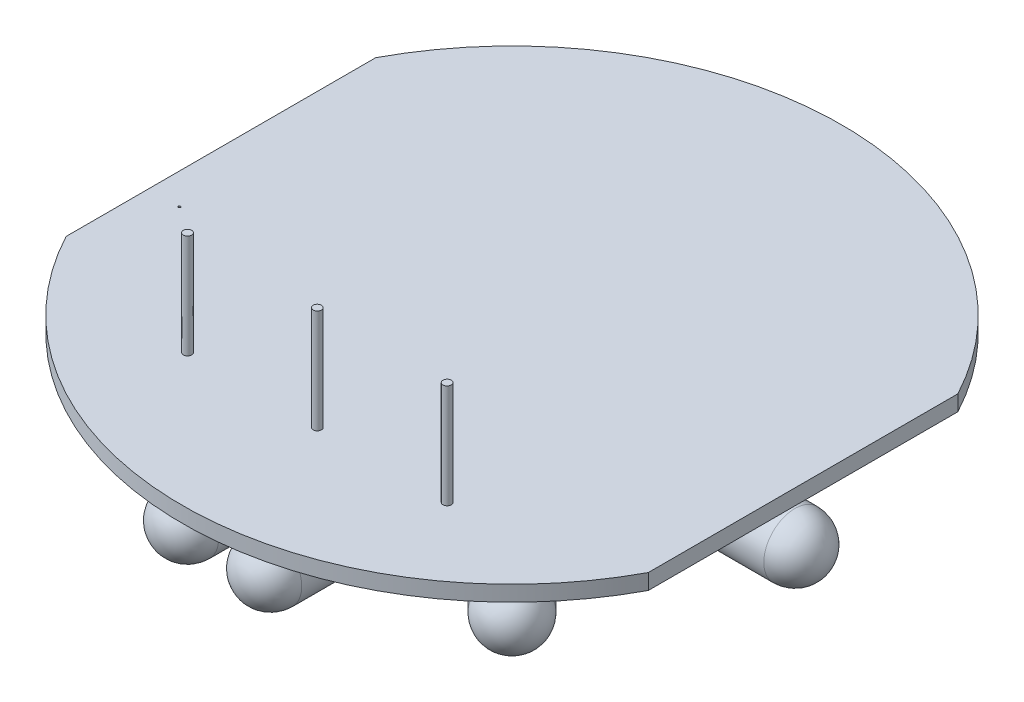
ISO-10303-21;
HEADER;
FILE_DESCRIPTION(('STEP AP214'),'2;1');
FILE_NAME('part.step','',(''),(''),'','','');
FILE_SCHEMA(('AUTOMOTIVE_DESIGN { 1 0 10303 214 1 1 1 1 }'));
ENDSEC;
DATA;
#1=APPLICATION_CONTEXT('core data for automotive mechanical design processes');
#2=APPLICATION_PROTOCOL_DEFINITION('international standard','automotive_design',2000,#1);
#3=PRODUCT_CONTEXT('',#1,'mechanical');
#4=PRODUCT('Part','Part','',(#3));
#5=PRODUCT_RELATED_PRODUCT_CATEGORY('part','',(#4));
#6=PRODUCT_DEFINITION_FORMATION('','',#4);
#7=PRODUCT_DEFINITION_CONTEXT('part definition',#1,'design');
#8=PRODUCT_DEFINITION('design','',#6,#7);
#9=PRODUCT_DEFINITION_SHAPE('','',#8);
#10=(LENGTH_UNIT() NAMED_UNIT(*) SI_UNIT(.MILLI.,.METRE.));
#11=(NAMED_UNIT(*) PLANE_ANGLE_UNIT() SI_UNIT($,.RADIAN.));
#12=(NAMED_UNIT(*) SI_UNIT($,.STERADIAN.) SOLID_ANGLE_UNIT());
#13=UNCERTAINTY_MEASURE_WITH_UNIT(LENGTH_MEASURE(1.E-05),#10,'distance_accuracy_value','');
#14=(GEOMETRIC_REPRESENTATION_CONTEXT(3) GLOBAL_UNCERTAINTY_ASSIGNED_CONTEXT((#13)) GLOBAL_UNIT_ASSIGNED_CONTEXT((#10,
#11,#12)) REPRESENTATION_CONTEXT('',''));
#15=CARTESIAN_POINT('',(0.,0.,0.));
#16=DIRECTION('',(0.,0.,1.));
#17=DIRECTION('',(1.,0.,0.));
#18=AXIS2_PLACEMENT_3D('',#15,#16,#17);
#19=CARTESIAN_POINT('',(-0.999999999999999,-4.,21.75));
#20=DIRECTION('',(0.,0.,1.));
#21=DIRECTION('',(1.,0.,0.));
#22=AXIS2_PLACEMENT_3D('',#19,#20,#21);
#23=PLANE('',#22);
#24=CARTESIAN_POINT('',(-4.,-4.,21.75));
#25=DIRECTION('',(0.,0.,-1.));
#26=DIRECTION('',(-1.,0.,0.));
#27=AXIS2_PLACEMENT_3D('',#24,#25,#26);
#28=CIRCLE('',#27,3.);
#29=CARTESIAN_POINT('',(-7.,-4.,21.75));
#30=VERTEX_POINT('',#29);
#31=EDGE_CURVE('E46',#30,#30,#28,.T.);
#32=ORIENTED_EDGE('',*,*,#31,.T.);
#33=EDGE_LOOP('',(#32));
#34=FACE_BOUND('',#33,.T.);
#35=ADVANCED_FACE('F40',(#34),#23,.F.);
#36=CARTESIAN_POINT('',(-4.,-4.,27.25));
#37=DIRECTION('',(0.,0.,-1.));
#38=DIRECTION('',(-1.,0.,0.));
#39=AXIS2_PLACEMENT_3D('',#36,#37,#38);
#40=SPHERICAL_SURFACE('',#39,3.);
#41=CARTESIAN_POINT('',(-4.,-4.,27.25));
#42=DIRECTION('',(0.,0.,-1.));
#43=DIRECTION('',(-1.,0.,0.));
#44=AXIS2_PLACEMENT_3D('',#41,#42,#43);
#45=CIRCLE('',#44,3.);
#46=CARTESIAN_POINT('',(-7.,-4.,27.25));
#47=VERTEX_POINT('',#46);
#48=EDGE_CURVE('E11',#47,#47,#45,.T.);
#49=ORIENTED_EDGE('',*,*,#48,.F.);
#50=EDGE_LOOP('',(#49));
#51=FACE_BOUND('',#50,.T.);
#52=ADVANCED_FACE('F55',(#51),#40,.T.);
#53=CARTESIAN_POINT('',(-4.,-4.,21.75));
#54=DIRECTION('',(0.,0.,-1.));
#55=DIRECTION('',(-1.,0.,0.));
#56=AXIS2_PLACEMENT_3D('',#53,#54,#55);
#57=CYLINDRICAL_SURFACE('',#56,3.);
#58=ORIENTED_EDGE('',*,*,#31,.F.);
#59=EDGE_LOOP('',(#58));
#60=FACE_BOUND('',#59,.T.);
#61=ORIENTED_EDGE('',*,*,#48,.T.);
#62=EDGE_LOOP('',(#61));
#63=FACE_BOUND('',#62,.T.);
#64=ADVANCED_FACE('F53',(#60,#63),#57,.T.);
#65=CLOSED_SHELL('',(#35,#52,#64));
#66=MANIFOLD_SOLID_BREP('B2',#65);
#67=CARTESIAN_POINT('',(7.,-4.,21.75));
#68=DIRECTION('',(0.,0.,1.));
#69=DIRECTION('',(1.,0.,0.));
#70=AXIS2_PLACEMENT_3D('',#67,#68,#69);
#71=PLANE('',#70);
#72=CARTESIAN_POINT('',(4.,-4.,21.75));
#73=DIRECTION('',(0.,0.,-1.));
#74=DIRECTION('',(-1.,0.,0.));
#75=AXIS2_PLACEMENT_3D('',#72,#73,#74);
#76=CIRCLE('',#75,3.);
#77=CARTESIAN_POINT('',(0.999999999999999,-4.,21.75));
#78=VERTEX_POINT('',#77);
#79=EDGE_CURVE('E95',#78,#78,#76,.T.);
#80=ORIENTED_EDGE('',*,*,#79,.T.);
#81=EDGE_LOOP('',(#80));
#82=FACE_BOUND('',#81,.T.);
#83=ADVANCED_FACE('F89',(#82),#71,.F.);
#84=CARTESIAN_POINT('',(4.,-4.,27.25));
#85=DIRECTION('',(0.,0.,-1.));
#86=DIRECTION('',(-1.,0.,0.));
#87=AXIS2_PLACEMENT_3D('',#84,#85,#86);
#88=SPHERICAL_SURFACE('',#87,3.);
#89=CARTESIAN_POINT('',(4.,-4.,27.25));
#90=DIRECTION('',(0.,0.,-1.));
#91=DIRECTION('',(-1.,0.,0.));
#92=AXIS2_PLACEMENT_3D('',#89,#90,#91);
#93=CIRCLE('',#92,3.);
#94=CARTESIAN_POINT('',(0.999999999999999,-4.,27.25));
#95=VERTEX_POINT('',#94);
#96=EDGE_CURVE('E39',#95,#95,#93,.T.);
#97=ORIENTED_EDGE('',*,*,#96,.F.);
#98=EDGE_LOOP('',(#97));
#99=FACE_BOUND('',#98,.T.);
#100=ADVANCED_FACE('F104',(#99),#88,.T.);
#101=CARTESIAN_POINT('',(4.,-4.,21.75));
#102=DIRECTION('',(0.,0.,-1.));
#103=DIRECTION('',(-1.,0.,0.));
#104=AXIS2_PLACEMENT_3D('',#101,#102,#103);
#105=CYLINDRICAL_SURFACE('',#104,3.);
#106=ORIENTED_EDGE('',*,*,#79,.F.);
#107=EDGE_LOOP('',(#106));
#108=FACE_BOUND('',#107,.T.);
#109=ORIENTED_EDGE('',*,*,#96,.T.);
#110=EDGE_LOOP('',(#109));
#111=FACE_BOUND('',#110,.T.);
#112=ADVANCED_FACE('F102',(#108,#111),#105,.T.);
#113=CLOSED_SHELL('',(#83,#100,#112));
#114=MANIFOLD_SOLID_BREP('B6',#113);
#115=CARTESIAN_POINT('',(3.,-4.,-21.75));
#116=DIRECTION('',(0.,0.,1.));
#117=DIRECTION('',(1.,0.,0.));
#118=AXIS2_PLACEMENT_3D('',#115,#116,#117);
#119=PLANE('',#118);
#120=CARTESIAN_POINT('',(0.,-4.,-21.75));
#121=DIRECTION('',(0.,0.,1.));
#122=DIRECTION('',(1.,0.,0.));
#123=AXIS2_PLACEMENT_3D('',#120,#121,#122);
#124=CIRCLE('',#123,3.);
#125=CARTESIAN_POINT('',(3.,-4.,-21.75));
#126=VERTEX_POINT('',#125);
#127=EDGE_CURVE('E144',#126,#126,#124,.T.);
#128=ORIENTED_EDGE('',*,*,#127,.T.);
#129=EDGE_LOOP('',(#128));
#130=FACE_BOUND('',#129,.T.);
#131=ADVANCED_FACE('F138',(#130),#119,.T.);
#132=CARTESIAN_POINT('',(0.,-4.,-27.25));
#133=DIRECTION('',(0.,0.,1.));
#134=DIRECTION('',(1.,0.,0.));
#135=AXIS2_PLACEMENT_3D('',#132,#133,#134);
#136=SPHERICAL_SURFACE('',#135,3.);
#137=CARTESIAN_POINT('',(0.,-4.,-27.25));
#138=DIRECTION('',(0.,0.,1.));
#139=DIRECTION('',(1.,0.,0.));
#140=AXIS2_PLACEMENT_3D('',#137,#138,#139);
#141=CIRCLE('',#140,3.);
#142=CARTESIAN_POINT('',(3.,-4.,-27.25));
#143=VERTEX_POINT('',#142);
#144=EDGE_CURVE('E88',#143,#143,#141,.T.);
#145=ORIENTED_EDGE('',*,*,#144,.F.);
#146=EDGE_LOOP('',(#145));
#147=FACE_BOUND('',#146,.T.);
#148=ADVANCED_FACE('F153',(#147),#136,.T.);
#149=CARTESIAN_POINT('',(0.,-4.,-21.75));
#150=DIRECTION('',(0.,0.,1.));
#151=DIRECTION('',(1.,0.,0.));
#152=AXIS2_PLACEMENT_3D('',#149,#150,#151);
#153=CYLINDRICAL_SURFACE('',#152,3.);
#154=ORIENTED_EDGE('',*,*,#144,.T.);
#155=EDGE_LOOP('',(#154));
#156=FACE_BOUND('',#155,.T.);
#157=ORIENTED_EDGE('',*,*,#127,.F.);
#158=EDGE_LOOP('',(#157));
#159=FACE_BOUND('',#158,.T.);
#160=ADVANCED_FACE('F151',(#156,#159),#153,.T.);
#161=CLOSED_SHELL('',(#131,#148,#160));
#162=MANIFOLD_SOLID_BREP('B34',#161);
#163=CARTESIAN_POINT('',(-13.2582521472476,-3.99999999999992,-17.5008928343672));
#164=DIRECTION('',(0.707106781186539,0.,0.707106781186556));
#165=DIRECTION('',(0.707106781186556,0.,-0.707106781186539));
#166=AXIS2_PLACEMENT_3D('',#163,#164,#165);
#167=PLANE('',#166);
#168=CARTESIAN_POINT('',(-15.3795724908072,-3.99999999999993,-15.3795724908076));
#169=DIRECTION('',(0.707106781186539,0.,0.707106781186556));
#170=DIRECTION('',(0.707106781186556,0.,-0.707106781186539));
#171=AXIS2_PLACEMENT_3D('',#168,#169,#170);
#172=CIRCLE('',#171,3.);
#173=CARTESIAN_POINT('',(-13.2582521472476,-3.99999999999992,-17.5008928343672));
#174=VERTEX_POINT('',#173);
#175=EDGE_CURVE('E193',#174,#174,#172,.T.);
#176=ORIENTED_EDGE('',*,*,#175,.T.);
#177=EDGE_LOOP('',(#176));
#178=FACE_BOUND('',#177,.T.);
#179=ADVANCED_FACE('F187',(#178),#167,.T.);
#180=CARTESIAN_POINT('',(-19.2686597873332,-3.99999999999991,-19.2686597873337));
#181=DIRECTION('',(0.707106781186539,0.,0.707106781186556));
#182=DIRECTION('',(0.707106781186556,0.,-0.707106781186539));
#183=AXIS2_PLACEMENT_3D('',#180,#181,#182);
#184=SPHERICAL_SURFACE('',#183,3.);
#185=CARTESIAN_POINT('',(-19.2686597873332,-3.99999999999991,-19.2686597873337));
#186=DIRECTION('',(0.707106781186539,0.,0.707106781186556));
#187=DIRECTION('',(0.707106781186556,0.,-0.707106781186539));
#188=AXIS2_PLACEMENT_3D('',#185,#186,#187);
#189=CIRCLE('',#188,3.);
#190=CARTESIAN_POINT('',(-17.1473394437735,-3.99999999999991,-21.3899801308933));
#191=VERTEX_POINT('',#190);
#192=EDGE_CURVE('E137',#191,#191,#189,.T.);
#193=ORIENTED_EDGE('',*,*,#192,.F.);
#194=EDGE_LOOP('',(#193));
#195=FACE_BOUND('',#194,.T.);
#196=ADVANCED_FACE('F202',(#195),#184,.T.);
#197=CARTESIAN_POINT('',(-15.3795724908072,-3.99999999999993,-15.3795724908076));
#198=DIRECTION('',(0.707106781186539,0.,0.707106781186556));
#199=DIRECTION('',(0.707106781186556,0.,-0.707106781186539));
#200=AXIS2_PLACEMENT_3D('',#197,#198,#199);
#201=CYLINDRICAL_SURFACE('',#200,3.);
#202=ORIENTED_EDGE('',*,*,#192,.T.);
#203=EDGE_LOOP('',(#202));
#204=FACE_BOUND('',#203,.T.);
#205=ORIENTED_EDGE('',*,*,#175,.F.);
#206=EDGE_LOOP('',(#205));
#207=FACE_BOUND('',#206,.T.);
#208=ADVANCED_FACE('F200',(#204,#207),#201,.T.);
#209=CLOSED_SHELL('',(#179,#196,#208));
#210=MANIFOLD_SOLID_BREP('B83',#209);
#211=CARTESIAN_POINT('',(-21.75,-3.99999999999989,-3.00000000000025));
#212=DIRECTION('',(1.,0.,0.));
#213=DIRECTION('',(0.,0.,-1.));
#214=AXIS2_PLACEMENT_3D('',#211,#212,#213);
#215=PLANE('',#214);
#216=CARTESIAN_POINT('',(-21.75,-3.9999999999999,-2.45889193567606E-13));
#217=DIRECTION('',(1.,0.,0.));
#218=DIRECTION('',(0.,0.,-1.));
#219=AXIS2_PLACEMENT_3D('',#216,#217,#218);
#220=CIRCLE('',#219,3.);
#221=CARTESIAN_POINT('',(-21.75,-3.99999999999989,-3.00000000000025));
#222=VERTEX_POINT('',#221);
#223=EDGE_CURVE('E242',#222,#222,#220,.T.);
#224=ORIENTED_EDGE('',*,*,#223,.T.);
#225=EDGE_LOOP('',(#224));
#226=FACE_BOUND('',#225,.T.);
#227=ADVANCED_FACE('F236',(#226),#215,.T.);
#228=CARTESIAN_POINT('',(-27.25,-3.99999999999987,-3.03932316527512E-13));
#229=DIRECTION('',(1.,0.,0.));
#230=DIRECTION('',(0.,0.,-1.));
#231=AXIS2_PLACEMENT_3D('',#228,#229,#230);
#232=SPHERICAL_SURFACE('',#231,3.);
#233=CARTESIAN_POINT('',(-27.25,-3.99999999999987,-3.02874044243639E-13));
#234=DIRECTION('',(1.,0.,0.));
#235=DIRECTION('',(0.,0.,-1.));
#236=AXIS2_PLACEMENT_3D('',#233,#234,#235);
#237=CIRCLE('',#236,3.);
#238=CARTESIAN_POINT('',(-27.25,-3.99999999999986,-3.0000000000003));
#239=VERTEX_POINT('',#238);
#240=EDGE_CURVE('E186',#239,#239,#237,.T.);
#241=ORIENTED_EDGE('',*,*,#240,.F.);
#242=EDGE_LOOP('',(#241));
#243=FACE_BOUND('',#242,.T.);
#244=ADVANCED_FACE('F251',(#243),#232,.T.);
#245=CARTESIAN_POINT('',(-21.75,-3.9999999999999,-2.45889193567606E-13));
#246=DIRECTION('',(1.,0.,0.));
#247=DIRECTION('',(0.,0.,-1.));
#248=AXIS2_PLACEMENT_3D('',#245,#246,#247);
#249=CYLINDRICAL_SURFACE('',#248,3.);
#250=ORIENTED_EDGE('',*,*,#240,.T.);
#251=EDGE_LOOP('',(#250));
#252=FACE_BOUND('',#251,.T.);
#253=ORIENTED_EDGE('',*,*,#223,.F.);
#254=EDGE_LOOP('',(#253));
#255=FACE_BOUND('',#254,.T.);
#256=ADVANCED_FACE('F249',(#252,#255),#249,.T.);
#257=CLOSED_SHELL('',(#227,#244,#256));
#258=MANIFOLD_SOLID_BREP('B132',#257);
#259=CARTESIAN_POINT('',(-17.5008928343672,-3.99999999999991,13.2582521472476));
#260=DIRECTION('',(0.707106781186554,0.,-0.707106781186541));
#261=DIRECTION('',(-0.707106781186541,0.,-0.707106781186554));
#262=AXIS2_PLACEMENT_3D('',#259,#260,#261);
#263=PLANE('',#262);
#264=CARTESIAN_POINT('',(-15.3795724908076,-3.99999999999993,15.3795724908073));
#265=DIRECTION('',(0.707106781186554,0.,-0.707106781186541));
#266=DIRECTION('',(-0.707106781186541,0.,-0.707106781186554));
#267=AXIS2_PLACEMENT_3D('',#264,#265,#266);
#268=CIRCLE('',#267,3.);
#269=CARTESIAN_POINT('',(-17.5008928343672,-3.99999999999991,13.2582521472476));
#270=VERTEX_POINT('',#269);
#271=EDGE_CURVE('E291',#270,#270,#268,.T.);
#272=ORIENTED_EDGE('',*,*,#271,.T.);
#273=EDGE_LOOP('',(#272));
#274=FACE_BOUND('',#273,.T.);
#275=ADVANCED_FACE('F285',(#274),#263,.T.);
#276=CARTESIAN_POINT('',(-19.2686597873336,-3.99999999999991,19.2686597873332));
#277=DIRECTION('',(0.707106781186554,0.,-0.707106781186541));
#278=DIRECTION('',(-0.707106781186541,0.,-0.707106781186554));
#279=AXIS2_PLACEMENT_3D('',#276,#277,#278);
#280=SPHERICAL_SURFACE('',#279,3.);
#281=CARTESIAN_POINT('',(-19.2686597873336,-3.99999999999991,19.2686597873332));
#282=DIRECTION('',(0.707106781186554,0.,-0.707106781186541));
#283=DIRECTION('',(-0.707106781186541,0.,-0.707106781186554));
#284=AXIS2_PLACEMENT_3D('',#281,#282,#283);
#285=CIRCLE('',#284,3.);
#286=CARTESIAN_POINT('',(-21.3899801308932,-3.99999999999989,17.1473394437736));
#287=VERTEX_POINT('',#286);
#288=EDGE_CURVE('E235',#287,#287,#285,.T.);
#289=ORIENTED_EDGE('',*,*,#288,.F.);
#290=EDGE_LOOP('',(#289));
#291=FACE_BOUND('',#290,.T.);
#292=ADVANCED_FACE('F300',(#291),#280,.T.);
#293=CARTESIAN_POINT('',(-15.3795724908076,-3.99999999999993,15.3795724908073));
#294=DIRECTION('',(0.707106781186554,0.,-0.707106781186541));
#295=DIRECTION('',(-0.707106781186541,0.,-0.707106781186554));
#296=AXIS2_PLACEMENT_3D('',#293,#294,#295);
#297=CYLINDRICAL_SURFACE('',#296,3.);
#298=ORIENTED_EDGE('',*,*,#288,.T.);
#299=EDGE_LOOP('',(#298));
#300=FACE_BOUND('',#299,.T.);
#301=ORIENTED_EDGE('',*,*,#271,.F.);
#302=EDGE_LOOP('',(#301));
#303=FACE_BOUND('',#302,.T.);
#304=ADVANCED_FACE('F298',(#300,#303),#297,.T.);
#305=CLOSED_SHELL('',(#275,#292,#304));
#306=MANIFOLD_SOLID_BREP('B181',#305);
#307=CARTESIAN_POINT('',(13.2582521472476,-4.00000000000005,17.5008928343671));
#308=DIRECTION('',(-0.707106781186544,0.,-0.707106781186551));
#309=DIRECTION('',(-0.707106781186551,0.,0.707106781186544));
#310=AXIS2_PLACEMENT_3D('',#307,#308,#309);
#311=PLANE('',#310);
#312=CARTESIAN_POINT('',(15.3795724908073,-4.00000000000007,15.3795724908075));
#313=DIRECTION('',(-0.707106781186544,0.,-0.707106781186551));
#314=DIRECTION('',(-0.707106781186551,0.,0.707106781186544));
#315=AXIS2_PLACEMENT_3D('',#312,#313,#314);
#316=CIRCLE('',#315,3.);
#317=CARTESIAN_POINT('',(13.2582521472476,-4.00000000000005,17.5008928343671));
#318=VERTEX_POINT('',#317);
#319=EDGE_CURVE('E340',#318,#318,#316,.T.);
#320=ORIENTED_EDGE('',*,*,#319,.T.);
#321=EDGE_LOOP('',(#320));
#322=FACE_BOUND('',#321,.T.);
#323=ADVANCED_FACE('F334',(#322),#311,.T.);
#324=CARTESIAN_POINT('',(19.2686597873333,-4.00000000000009,19.2686597873335));
#325=DIRECTION('',(-0.707106781186544,0.,-0.707106781186551));
#326=DIRECTION('',(-0.707106781186551,0.,0.707106781186544));
#327=AXIS2_PLACEMENT_3D('',#324,#325,#326);
#328=SPHERICAL_SURFACE('',#327,3.);
#329=CARTESIAN_POINT('',(19.2686597873333,-4.00000000000009,19.2686597873335));
#330=DIRECTION('',(-0.707106781186544,0.,-0.707106781186551));
#331=DIRECTION('',(-0.707106781186551,0.,0.707106781186544));
#332=AXIS2_PLACEMENT_3D('',#329,#330,#331);
#333=CIRCLE('',#332,3.);
#334=CARTESIAN_POINT('',(17.1473394437736,-4.00000000000007,21.3899801308932));
#335=VERTEX_POINT('',#334);
#336=EDGE_CURVE('E284',#335,#335,#333,.T.);
#337=ORIENTED_EDGE('',*,*,#336,.F.);
#338=EDGE_LOOP('',(#337));
#339=FACE_BOUND('',#338,.T.);
#340=ADVANCED_FACE('F349',(#339),#328,.T.);
#341=CARTESIAN_POINT('',(15.3795724908073,-4.00000000000007,15.3795724908075));
#342=DIRECTION('',(-0.707106781186544,0.,-0.707106781186551));
#343=DIRECTION('',(-0.707106781186551,0.,0.707106781186544));
#344=AXIS2_PLACEMENT_3D('',#341,#342,#343);
#345=CYLINDRICAL_SURFACE('',#344,3.);
#346=ORIENTED_EDGE('',*,*,#336,.T.);
#347=EDGE_LOOP('',(#346));
#348=FACE_BOUND('',#347,.T.);
#349=ORIENTED_EDGE('',*,*,#319,.F.);
#350=EDGE_LOOP('',(#349));
#351=FACE_BOUND('',#350,.T.);
#352=ADVANCED_FACE('F347',(#348,#351),#345,.T.);
#353=CLOSED_SHELL('',(#323,#340,#352));
#354=MANIFOLD_SOLID_BREP('B230',#353);
#355=CARTESIAN_POINT('',(21.75,-4.00000000000009,3.00000000000009));
#356=DIRECTION('',(-1.,0.,0.));
#357=DIRECTION('',(0.,0.,1.));
#358=AXIS2_PLACEMENT_3D('',#355,#356,#357);
#359=PLANE('',#358);
#360=CARTESIAN_POINT('',(21.75,-4.0000000000001,0.));
#361=DIRECTION('',(-1.,0.,0.));
#362=DIRECTION('',(0.,0.,1.));
#363=AXIS2_PLACEMENT_3D('',#360,#361,#362);
#364=CIRCLE('',#363,3.);
#365=CARTESIAN_POINT('',(21.75,-4.00000000000009,3.00000000000009));
#366=VERTEX_POINT('',#365);
#367=EDGE_CURVE('E389',#366,#366,#364,.T.);
#368=ORIENTED_EDGE('',*,*,#367,.T.);
#369=EDGE_LOOP('',(#368));
#370=FACE_BOUND('',#369,.T.);
#371=ADVANCED_FACE('F383',(#370),#359,.T.);
#372=CARTESIAN_POINT('',(27.25,-4.00000000000013,1.13646583560561E-13));
#373=DIRECTION('',(-1.,0.,0.));
#374=DIRECTION('',(0.,0.,1.));
#375=AXIS2_PLACEMENT_3D('',#372,#373,#374);
#376=SPHERICAL_SURFACE('',#375,3.);
#377=CARTESIAN_POINT('',(27.25,-4.00000000000013,1.12588311276688E-13));
#378=DIRECTION('',(-1.,0.,0.));
#379=DIRECTION('',(0.,0.,1.));
#380=AXIS2_PLACEMENT_3D('',#377,#378,#379);
#381=CIRCLE('',#380,3.);
#382=CARTESIAN_POINT('',(27.25,-4.00000000000011,3.00000000000011));
#383=VERTEX_POINT('',#382);
#384=EDGE_CURVE('E333',#383,#383,#381,.T.);
#385=ORIENTED_EDGE('',*,*,#384,.F.);
#386=EDGE_LOOP('',(#385));
#387=FACE_BOUND('',#386,.T.);
#388=ADVANCED_FACE('F398',(#387),#376,.T.);
#389=CARTESIAN_POINT('',(21.75,-4.0000000000001,0.));
#390=DIRECTION('',(-1.,0.,0.));
#391=DIRECTION('',(0.,0.,1.));
#392=AXIS2_PLACEMENT_3D('',#389,#390,#391);
#393=CYLINDRICAL_SURFACE('',#392,3.);
#394=ORIENTED_EDGE('',*,*,#384,.T.);
#395=EDGE_LOOP('',(#394));
#396=FACE_BOUND('',#395,.T.);
#397=ORIENTED_EDGE('',*,*,#367,.F.);
#398=EDGE_LOOP('',(#397));
#399=FACE_BOUND('',#398,.T.);
#400=ADVANCED_FACE('F396',(#396,#399),#393,.T.);
#401=CLOSED_SHELL('',(#371,#388,#400));
#402=MANIFOLD_SOLID_BREP('B279',#401);
#403=CARTESIAN_POINT('',(17.5008928343671,-4.00000000000007,-13.2582521472477));
#404=DIRECTION('',(-0.707106781186549,0.,0.707106781186546));
#405=DIRECTION('',(0.707106781186546,0.,0.707106781186549));
#406=AXIS2_PLACEMENT_3D('',#403,#404,#405);
#407=PLANE('',#406);
#408=CARTESIAN_POINT('',(15.3795724908074,-4.00000000000007,-15.3795724908074));
#409=DIRECTION('',(-0.707106781186549,0.,0.707106781186546));
#410=DIRECTION('',(0.707106781186546,0.,0.707106781186549));
#411=AXIS2_PLACEMENT_3D('',#408,#409,#410);
#412=CIRCLE('',#411,3.);
#413=CARTESIAN_POINT('',(17.5008928343671,-4.00000000000007,-13.2582521472477));
#414=VERTEX_POINT('',#413);
#415=EDGE_CURVE('E438',#414,#414,#412,.T.);
#416=ORIENTED_EDGE('',*,*,#415,.T.);
#417=EDGE_LOOP('',(#416));
#418=FACE_BOUND('',#417,.T.);
#419=ADVANCED_FACE('F432',(#418),#407,.T.);
#420=CARTESIAN_POINT('',(19.2686597873334,-4.00000000000009,-19.2686597873334));
#421=DIRECTION('',(-0.707106781186549,0.,0.707106781186546));
#422=DIRECTION('',(0.707106781186546,0.,0.707106781186549));
#423=AXIS2_PLACEMENT_3D('',#420,#421,#422);
#424=SPHERICAL_SURFACE('',#423,3.);
#425=CARTESIAN_POINT('',(19.2686597873334,-4.00000000000009,-19.2686597873334));
#426=DIRECTION('',(-0.707106781186549,0.,0.707106781186546));
#427=DIRECTION('',(0.707106781186546,0.,0.707106781186549));
#428=AXIS2_PLACEMENT_3D('',#425,#426,#427);
#429=CIRCLE('',#428,3.);
#430=CARTESIAN_POINT('',(21.3899801308931,-4.00000000000009,-17.1473394437737));
#431=VERTEX_POINT('',#430);
#432=EDGE_CURVE('E382',#431,#431,#429,.T.);
#433=ORIENTED_EDGE('',*,*,#432,.F.);
#434=EDGE_LOOP('',(#433));
#435=FACE_BOUND('',#434,.T.);
#436=ADVANCED_FACE('F447',(#435),#424,.T.);
#437=CARTESIAN_POINT('',(15.3795724908074,-4.00000000000007,-15.3795724908074));
#438=DIRECTION('',(-0.707106781186549,0.,0.707106781186546));
#439=DIRECTION('',(0.707106781186546,0.,0.707106781186549));
#440=AXIS2_PLACEMENT_3D('',#437,#438,#439);
#441=CYLINDRICAL_SURFACE('',#440,3.);
#442=ORIENTED_EDGE('',*,*,#432,.T.);
#443=EDGE_LOOP('',(#442));
#444=FACE_BOUND('',#443,.T.);
#445=ORIENTED_EDGE('',*,*,#415,.F.);
#446=EDGE_LOOP('',(#445));
#447=FACE_BOUND('',#446,.T.);
#448=ADVANCED_FACE('F445',(#444,#447),#441,.T.);
#449=CLOSED_SHELL('',(#419,#436,#448));
#450=MANIFOLD_SOLID_BREP('B328',#449);
#451=CARTESIAN_POINT('',(3.,-4.,-21.75));
#452=DIRECTION('',(0.,0.,1.));
#453=DIRECTION('',(1.,0.,0.));
#454=AXIS2_PLACEMENT_3D('',#451,#452,#453);
#455=PLANE('',#454);
#456=CARTESIAN_POINT('',(0.,-4.,-21.75));
#457=DIRECTION('',(0.,0.,1.));
#458=DIRECTION('',(1.,0.,0.));
#459=AXIS2_PLACEMENT_3D('',#456,#457,#458);
#460=CIRCLE('',#459,3.);
#461=CARTESIAN_POINT('',(3.,-4.,-21.75));
#462=VERTEX_POINT('',#461);
#463=EDGE_CURVE('E488',#462,#462,#460,.T.);
#464=ORIENTED_EDGE('',*,*,#463,.T.);
#465=EDGE_LOOP('',(#464));
#466=FACE_BOUND('',#465,.T.);
#467=ADVANCED_FACE('F482',(#466),#455,.T.);
#468=CARTESIAN_POINT('',(0.,-4.,-27.25));
#469=DIRECTION('',(0.,0.,1.));
#470=DIRECTION('',(1.,0.,0.));
#471=AXIS2_PLACEMENT_3D('',#468,#469,#470);
#472=SPHERICAL_SURFACE('',#471,3.);
#473=CARTESIAN_POINT('',(0.,-4.,-27.25));
#474=DIRECTION('',(0.,0.,1.));
#475=DIRECTION('',(1.,0.,0.));
#476=AXIS2_PLACEMENT_3D('',#473,#474,#475);
#477=CIRCLE('',#476,3.);
#478=CARTESIAN_POINT('',(3.,-4.,-27.25));
#479=VERTEX_POINT('',#478);
#480=EDGE_CURVE('E431',#479,#479,#477,.T.);
#481=ORIENTED_EDGE('',*,*,#480,.F.);
#482=EDGE_LOOP('',(#481));
#483=FACE_BOUND('',#482,.T.);
#484=ADVANCED_FACE('F497',(#483),#472,.T.);
#485=CARTESIAN_POINT('',(0.,-4.,-21.75));
#486=DIRECTION('',(0.,0.,1.));
#487=DIRECTION('',(1.,0.,0.));
#488=AXIS2_PLACEMENT_3D('',#485,#486,#487);
#489=CYLINDRICAL_SURFACE('',#488,3.);
#490=ORIENTED_EDGE('',*,*,#480,.T.);
#491=EDGE_LOOP('',(#490));
#492=FACE_BOUND('',#491,.T.);
#493=ORIENTED_EDGE('',*,*,#463,.F.);
#494=EDGE_LOOP('',(#493));
#495=FACE_BOUND('',#494,.T.);
#496=ADVANCED_FACE('F495',(#492,#495),#489,.T.);
#497=CLOSED_SHELL('',(#467,#484,#496));
#498=MANIFOLD_SOLID_BREP('B377',#497);
#499=CARTESIAN_POINT('',(0.,1.5,0.));
#500=DIRECTION('',(0.,1.,0.));
#501=DIRECTION('',(0.,0.,1.));
#502=AXIS2_PLACEMENT_3D('',#499,#500,#501);
#503=PLANE('',#502);
#504=CARTESIAN_POINT('',(12.5,1.5,18.75));
#505=DIRECTION('',(0.,1.,0.));
#506=DIRECTION('',(0.,0.,1.));
#507=AXIS2_PLACEMENT_3D('',#504,#505,#506);
#508=CIRCLE('',#507,0.4);
#509=CARTESIAN_POINT('',(12.5,1.5,19.15));
#510=VERTEX_POINT('',#509);
#511=EDGE_CURVE('E739',#510,#510,#508,.T.);
#512=ORIENTED_EDGE('',*,*,#511,.F.);
#513=EDGE_LOOP('',(#512));
#514=FACE_BOUND('',#513,.T.);
#515=CARTESIAN_POINT('',(-25.0497154503897,1.5,6.985));
#516=DIRECTION('',(0.,1.,0.));
#517=DIRECTION('',(0.,0.,1.));
#518=AXIS2_PLACEMENT_3D('',#515,#516,#517);
#519=CIRCLE('',#518,0.107499999999995);
#520=CARTESIAN_POINT('',(-25.0497154503897,1.5,7.0925));
#521=VERTEX_POINT('',#520);
#522=EDGE_CURVE('E612',#521,#521,#519,.T.);
#523=ORIENTED_EDGE('',*,*,#522,.F.);
#524=EDGE_LOOP('',(#523));
#525=FACE_BOUND('',#524,.T.);
#526=CARTESIAN_POINT('',(0.,1.5,0.));
#527=DIRECTION('',(0.,1.,0.));
#528=DIRECTION('',(0.,0.,1.));
#529=AXIS2_PLACEMENT_3D('',#526,#527,#528);
#530=CIRCLE('',#529,31.75);
#531=CARTESIAN_POINT('',(28.033586073271,1.5,-14.905722118452));
#532=VERTEX_POINT('',#531);
#533=CARTESIAN_POINT('',(-28.033586073271,1.5,-14.905722118452));
#534=VERTEX_POINT('',#533);
#535=EDGE_CURVE('E621',#532,#534,#530,.T.);
#536=ORIENTED_EDGE('',*,*,#535,.T.);
#537=DIRECTION('',(0.,0.,1.));
#538=VECTOR('',#537,1.);
#539=CARTESIAN_POINT('',(-28.033586073271,1.5,-14.905722118452));
#540=LINE('',#539,#538);
#541=CARTESIAN_POINT('',(-28.033586073271,1.5,14.905722118452));
#542=VERTEX_POINT('',#541);
#543=EDGE_CURVE('E624',#534,#542,#540,.T.);
#544=ORIENTED_EDGE('',*,*,#543,.T.);
#545=CARTESIAN_POINT('',(0.,1.5,0.));
#546=DIRECTION('',(0.,1.,0.));
#547=DIRECTION('',(0.,0.,1.));
#548=AXIS2_PLACEMENT_3D('',#545,#546,#547);
#549=CIRCLE('',#548,31.75);
#550=CARTESIAN_POINT('',(28.033586073271,1.5,14.905722118452));
#551=VERTEX_POINT('',#550);
#552=EDGE_CURVE('E627',#542,#551,#549,.T.);
#553=ORIENTED_EDGE('',*,*,#552,.T.);
#554=DIRECTION('',(0.,0.,-1.));
#555=VECTOR('',#554,1.);
#556=CARTESIAN_POINT('',(28.033586073271,1.5,-14.905722118452));
#557=LINE('',#556,#555);
#558=EDGE_CURVE('E629',#551,#532,#557,.T.);
#559=ORIENTED_EDGE('',*,*,#558,.T.);
#560=EDGE_LOOP('',(#536,#544,#553,#559));
#561=FACE_BOUND('',#560,.T.);
#562=CARTESIAN_POINT('',(0.,1.5,18.75));
#563=DIRECTION('',(0.,1.,0.));
#564=DIRECTION('',(0.,0.,1.));
#565=AXIS2_PLACEMENT_3D('',#562,#563,#564);
#566=CIRCLE('',#565,0.4);
#567=CARTESIAN_POINT('',(0.,1.5,19.15));
#568=VERTEX_POINT('',#567);
#569=EDGE_CURVE('E749',#568,#568,#566,.T.);
#570=ORIENTED_EDGE('',*,*,#569,.F.);
#571=EDGE_LOOP('',(#570));
#572=FACE_BOUND('',#571,.T.);
#573=CARTESIAN_POINT('',(-12.5,1.5,18.75));
#574=DIRECTION('',(0.,1.,0.));
#575=DIRECTION('',(0.,0.,1.));
#576=AXIS2_PLACEMENT_3D('',#573,#574,#575);
#577=CIRCLE('',#576,0.4);
#578=CARTESIAN_POINT('',(-12.5,1.5,19.15));
#579=VERTEX_POINT('',#578);
#580=EDGE_CURVE('E740',#579,#579,#577,.T.);
#581=ORIENTED_EDGE('',*,*,#580,.F.);
#582=EDGE_LOOP('',(#581));
#583=FACE_BOUND('',#582,.T.);
#584=ADVANCED_FACE('F523',(#514,#525,#561,#572,#583),#503,.T.);
#585=CARTESIAN_POINT('',(0.,0.,0.));
#586=DIRECTION('',(0.,1.,0.));
#587=DIRECTION('',(0.,0.,1.));
#588=AXIS2_PLACEMENT_3D('',#585,#586,#587);
#589=PLANE('',#588);
#590=CARTESIAN_POINT('',(-25.0497154503897,0.,6.985));
#591=DIRECTION('',(0.,1.,0.));
#592=DIRECTION('',(0.,0.,1.));
#593=AXIS2_PLACEMENT_3D('',#590,#591,#592);
#594=CIRCLE('',#593,0.107499999999995);
#595=CARTESIAN_POINT('',(-25.0497154503897,0.,7.0925));
#596=VERTEX_POINT('',#595);
#597=EDGE_CURVE('E609',#596,#596,#594,.T.);
#598=ORIENTED_EDGE('',*,*,#597,.T.);
#599=EDGE_LOOP('',(#598));
#600=FACE_BOUND('',#599,.T.);
#601=CARTESIAN_POINT('',(0.,0.,0.));
#602=DIRECTION('',(0.,1.,0.));
#603=DIRECTION('',(0.,0.,1.));
#604=AXIS2_PLACEMENT_3D('',#601,#602,#603);
#605=CIRCLE('',#604,31.75);
#606=CARTESIAN_POINT('',(28.033586073271,0.,-14.905722118452));
#607=VERTEX_POINT('',#606);
#608=CARTESIAN_POINT('',(-28.033586073271,0.,-14.905722118452));
#609=VERTEX_POINT('',#608);
#610=EDGE_CURVE('E619',#607,#609,#605,.T.);
#611=ORIENTED_EDGE('',*,*,#610,.F.);
#612=DIRECTION('',(0.,0.,-1.));
#613=VECTOR('',#612,1.);
#614=CARTESIAN_POINT('',(28.033586073271,0.,-14.905722118452));
#615=LINE('',#614,#613);
#616=CARTESIAN_POINT('',(28.033586073271,0.,14.905722118452));
#617=VERTEX_POINT('',#616);
#618=EDGE_CURVE('E625',#617,#607,#615,.T.);
#619=ORIENTED_EDGE('',*,*,#618,.F.);
#620=CARTESIAN_POINT('',(0.,0.,0.));
#621=DIRECTION('',(0.,1.,0.));
#622=DIRECTION('',(0.,0.,1.));
#623=AXIS2_PLACEMENT_3D('',#620,#621,#622);
#624=CIRCLE('',#623,31.75);
#625=CARTESIAN_POINT('',(-28.033586073271,0.,14.905722118452));
#626=VERTEX_POINT('',#625);
#627=EDGE_CURVE('E636',#626,#617,#624,.T.);
#628=ORIENTED_EDGE('',*,*,#627,.F.);
#629=DIRECTION('',(0.,0.,1.));
#630=VECTOR('',#629,1.);
#631=CARTESIAN_POINT('',(-28.033586073271,0.,-14.905722118452));
#632=LINE('',#631,#630);
#633=EDGE_CURVE('E634',#609,#626,#632,.T.);
#634=ORIENTED_EDGE('',*,*,#633,.F.);
#635=EDGE_LOOP('',(#611,#619,#628,#634));
#636=FACE_BOUND('',#635,.T.);
#637=DIRECTION('',(0.,0.,-1.));
#638=VECTOR('',#637,1.);
#639=CARTESIAN_POINT('',(-6.25,0.,13.43));
#640=LINE('',#639,#638);
#641=CARTESIAN_POINT('',(-6.25,0.,13.43));
#642=VERTEX_POINT('',#641);
#643=CARTESIAN_POINT('',(-6.25,0.,9.43));
#644=VERTEX_POINT('',#643);
#645=EDGE_CURVE('E608',#642,#644,#640,.T.);
#646=ORIENTED_EDGE('',*,*,#645,.F.);
#647=DIRECTION('',(-1.,0.,0.));
#648=VECTOR('',#647,1.);
#649=CARTESIAN_POINT('',(-6.25,0.,13.43));
#650=LINE('',#649,#648);
#651=CARTESIAN_POINT('',(6.25,0.,13.43));
#652=VERTEX_POINT('',#651);
#653=EDGE_CURVE('E605',#652,#642,#650,.T.);
#654=ORIENTED_EDGE('',*,*,#653,.F.);
#655=DIRECTION('',(0.,0.,1.));
#656=VECTOR('',#655,1.);
#657=CARTESIAN_POINT('',(6.25,0.,13.43));
#658=LINE('',#657,#656);
#659=CARTESIAN_POINT('',(6.25,0.,9.43));
#660=VERTEX_POINT('',#659);
#661=EDGE_CURVE('E543',#660,#652,#658,.T.);
#662=ORIENTED_EDGE('',*,*,#661,.F.);
#663=DIRECTION('',(1.,0.,0.));
#664=VECTOR('',#663,1.);
#665=CARTESIAN_POINT('',(-6.25,0.,9.43));
#666=LINE('',#665,#664);
#667=EDGE_CURVE('E538',#644,#660,#666,.T.);
#668=ORIENTED_EDGE('',*,*,#667,.F.);
#669=EDGE_LOOP('',(#646,#654,#662,#668));
#670=FACE_BOUND('',#669,.T.);
#671=ADVANCED_FACE('F654',(#600,#636,#670),#589,.F.);
#672=CARTESIAN_POINT('',(0.,1.5,0.));
#673=DIRECTION('',(0.,-1.,0.));
#674=DIRECTION('',(0.,0.,-1.));
#675=AXIS2_PLACEMENT_3D('',#672,#673,#674);
#676=CYLINDRICAL_SURFACE('',#675,31.75);
#677=ORIENTED_EDGE('',*,*,#610,.T.);
#678=DIRECTION('',(0.,-1.,0.));
#679=VECTOR('',#678,1.);
#680=CARTESIAN_POINT('',(-28.033586073271,1.5,-14.905722118452));
#681=LINE('',#680,#679);
#682=EDGE_CURVE('E480',#534,#609,#681,.T.);
#683=ORIENTED_EDGE('',*,*,#682,.F.);
#684=ORIENTED_EDGE('',*,*,#535,.F.);
#685=DIRECTION('',(0.,-1.,0.));
#686=VECTOR('',#685,1.);
#687=CARTESIAN_POINT('',(28.033586073271,1.5,-14.905722118452));
#688=LINE('',#687,#686);
#689=EDGE_CURVE('E631',#532,#607,#688,.T.);
#690=ORIENTED_EDGE('',*,*,#689,.T.);
#691=EDGE_LOOP('',(#677,#683,#684,#690));
#692=FACE_BOUND('',#691,.T.);
#693=ADVANCED_FACE('F525',(#692),#676,.T.);
#694=CARTESIAN_POINT('',(-28.033586073271,1.5,-14.905722118452));
#695=DIRECTION('',(1.,0.,0.));
#696=DIRECTION('',(0.,0.,-1.));
#697=AXIS2_PLACEMENT_3D('',#694,#695,#696);
#698=PLANE('',#697);
#699=ORIENTED_EDGE('',*,*,#633,.T.);
#700=DIRECTION('',(0.,-1.,0.));
#701=VECTOR('',#700,1.);
#702=CARTESIAN_POINT('',(-28.033586073271,1.5,14.905722118452));
#703=LINE('',#702,#701);
#704=EDGE_CURVE('E531',#542,#626,#703,.T.);
#705=ORIENTED_EDGE('',*,*,#704,.F.);
#706=ORIENTED_EDGE('',*,*,#543,.F.);
#707=ORIENTED_EDGE('',*,*,#682,.T.);
#708=EDGE_LOOP('',(#699,#705,#706,#707));
#709=FACE_BOUND('',#708,.T.);
#710=ADVANCED_FACE('F664',(#709),#698,.F.);
#711=CARTESIAN_POINT('',(0.,1.5,0.));
#712=DIRECTION('',(0.,-1.,0.));
#713=DIRECTION('',(0.,0.,-1.));
#714=AXIS2_PLACEMENT_3D('',#711,#712,#713);
#715=CYLINDRICAL_SURFACE('',#714,31.75);
#716=ORIENTED_EDGE('',*,*,#627,.T.);
#717=DIRECTION('',(0.,-1.,0.));
#718=VECTOR('',#717,1.);
#719=CARTESIAN_POINT('',(28.033586073271,1.5,14.905722118452));
#720=LINE('',#719,#718);
#721=EDGE_CURVE('E641',#551,#617,#720,.T.);
#722=ORIENTED_EDGE('',*,*,#721,.F.);
#723=ORIENTED_EDGE('',*,*,#552,.F.);
#724=ORIENTED_EDGE('',*,*,#704,.T.);
#725=EDGE_LOOP('',(#716,#722,#723,#724));
#726=FACE_BOUND('',#725,.T.);
#727=ADVANCED_FACE('F648',(#726),#715,.T.);
#728=CARTESIAN_POINT('',(28.033586073271,1.5,-14.905722118452));
#729=DIRECTION('',(-1.,0.,0.));
#730=DIRECTION('',(0.,0.,1.));
#731=AXIS2_PLACEMENT_3D('',#728,#729,#730);
#732=PLANE('',#731);
#733=ORIENTED_EDGE('',*,*,#618,.T.);
#734=ORIENTED_EDGE('',*,*,#689,.F.);
#735=ORIENTED_EDGE('',*,*,#558,.F.);
#736=ORIENTED_EDGE('',*,*,#721,.T.);
#737=EDGE_LOOP('',(#733,#734,#735,#736));
#738=FACE_BOUND('',#737,.T.);
#739=ADVANCED_FACE('F657',(#738),#732,.F.);
#740=CARTESIAN_POINT('',(-25.0497154503897,1.5,6.985));
#741=DIRECTION('',(0.,-1.,0.));
#742=DIRECTION('',(0.,0.,-1.));
#743=AXIS2_PLACEMENT_3D('',#740,#741,#742);
#744=CYLINDRICAL_SURFACE('',#743,0.107499999999995);
#745=ORIENTED_EDGE('',*,*,#522,.T.);
#746=EDGE_LOOP('',(#745));
#747=FACE_BOUND('',#746,.T.);
#748=ORIENTED_EDGE('',*,*,#597,.F.);
#749=EDGE_LOOP('',(#748));
#750=FACE_BOUND('',#749,.T.);
#751=ADVANCED_FACE('F682',(#747,#750),#744,.F.);
#752=CARTESIAN_POINT('',(-6.25,-4.,13.43));
#753=DIRECTION('',(1.,0.,0.));
#754=DIRECTION('',(0.,0.,-1.));
#755=AXIS2_PLACEMENT_3D('',#752,#753,#754);
#756=PLANE('',#755);
#757=ORIENTED_EDGE('',*,*,#645,.T.);
#758=DIRECTION('',(0.,1.,0.));
#759=VECTOR('',#758,1.);
#760=CARTESIAN_POINT('',(-6.25,-4.,9.43));
#761=LINE('',#760,#759);
#762=CARTESIAN_POINT('',(-6.25,-4.,9.43));
#763=VERTEX_POINT('',#762);
#764=EDGE_CURVE('E589',#763,#644,#761,.T.);
#765=ORIENTED_EDGE('',*,*,#764,.F.);
#766=DIRECTION('',(0.,0.,-1.));
#767=VECTOR('',#766,1.);
#768=CARTESIAN_POINT('',(-6.25,-4.,13.43));
#769=LINE('',#768,#767);
#770=CARTESIAN_POINT('',(-6.25,-4.,13.43));
#771=VERTEX_POINT('',#770);
#772=EDGE_CURVE('E596',#771,#763,#769,.T.);
#773=ORIENTED_EDGE('',*,*,#772,.F.);
#774=DIRECTION('',(0.,1.,0.));
#775=VECTOR('',#774,1.);
#776=CARTESIAN_POINT('',(-6.25,-4.,13.43));
#777=LINE('',#776,#775);
#778=EDGE_CURVE('E758',#771,#642,#777,.T.);
#779=ORIENTED_EDGE('',*,*,#778,.T.);
#780=EDGE_LOOP('',(#757,#765,#773,#779));
#781=FACE_BOUND('',#780,.T.);
#782=ADVANCED_FACE('F607',(#781),#756,.F.);
#783=CARTESIAN_POINT('',(-6.25,-4.,9.43));
#784=DIRECTION('',(0.,0.,1.));
#785=DIRECTION('',(1.,0.,0.));
#786=AXIS2_PLACEMENT_3D('',#783,#784,#785);
#787=PLANE('',#786);
#788=ORIENTED_EDGE('',*,*,#667,.T.);
#789=DIRECTION('',(0.,1.,0.));
#790=VECTOR('',#789,1.);
#791=CARTESIAN_POINT('',(6.25,-4.,9.43));
#792=LINE('',#791,#790);
#793=CARTESIAN_POINT('',(6.25,-4.,9.43));
#794=VERTEX_POINT('',#793);
#795=EDGE_CURVE('E592',#794,#660,#792,.T.);
#796=ORIENTED_EDGE('',*,*,#795,.F.);
#797=DIRECTION('',(1.,0.,0.));
#798=VECTOR('',#797,1.);
#799=CARTESIAN_POINT('',(-6.25,-4.,9.43));
#800=LINE('',#799,#798);
#801=EDGE_CURVE('E585',#763,#794,#800,.T.);
#802=ORIENTED_EDGE('',*,*,#801,.F.);
#803=ORIENTED_EDGE('',*,*,#764,.T.);
#804=EDGE_LOOP('',(#788,#796,#802,#803));
#805=FACE_BOUND('',#804,.T.);
#806=ADVANCED_FACE('F587',(#805),#787,.F.);
#807=CARTESIAN_POINT('',(6.25,-4.,13.43));
#808=DIRECTION('',(-1.,0.,0.));
#809=DIRECTION('',(0.,0.,1.));
#810=AXIS2_PLACEMENT_3D('',#807,#808,#809);
#811=PLANE('',#810);
#812=ORIENTED_EDGE('',*,*,#661,.T.);
#813=DIRECTION('',(0.,1.,0.));
#814=VECTOR('',#813,1.);
#815=CARTESIAN_POINT('',(6.25,-4.,13.43));
#816=LINE('',#815,#814);
#817=CARTESIAN_POINT('',(6.25,-4.,13.43));
#818=VERTEX_POINT('',#817);
#819=EDGE_CURVE('E614',#818,#652,#816,.T.);
#820=ORIENTED_EDGE('',*,*,#819,.F.);
#821=DIRECTION('',(0.,0.,1.));
#822=VECTOR('',#821,1.);
#823=CARTESIAN_POINT('',(6.25,-4.,13.43));
#824=LINE('',#823,#822);
#825=EDGE_CURVE('E595',#794,#818,#824,.T.);
#826=ORIENTED_EDGE('',*,*,#825,.F.);
#827=ORIENTED_EDGE('',*,*,#795,.T.);
#828=EDGE_LOOP('',(#812,#820,#826,#827));
#829=FACE_BOUND('',#828,.T.);
#830=ADVANCED_FACE('F699',(#829),#811,.F.);
#831=CARTESIAN_POINT('',(-6.25,-4.,13.43));
#832=DIRECTION('',(0.,0.,-1.));
#833=DIRECTION('',(-1.,0.,0.));
#834=AXIS2_PLACEMENT_3D('',#831,#832,#833);
#835=PLANE('',#834);
#836=ORIENTED_EDGE('',*,*,#653,.T.);
#837=ORIENTED_EDGE('',*,*,#778,.F.);
#838=DIRECTION('',(-1.,0.,0.));
#839=VECTOR('',#838,1.);
#840=CARTESIAN_POINT('',(-6.25,-4.,13.43));
#841=LINE('',#840,#839);
#842=EDGE_CURVE('E601',#818,#771,#841,.T.);
#843=ORIENTED_EDGE('',*,*,#842,.F.);
#844=ORIENTED_EDGE('',*,*,#819,.T.);
#845=EDGE_LOOP('',(#836,#837,#843,#844));
#846=FACE_BOUND('',#845,.T.);
#847=ADVANCED_FACE('F704',(#846),#835,.F.);
#848=CARTESIAN_POINT('',(-6.25,-4.,9.43));
#849=DIRECTION('',(0.,-1.,0.));
#850=DIRECTION('',(0.,0.,-1.));
#851=AXIS2_PLACEMENT_3D('',#848,#849,#850);
#852=PLANE('',#851);
#853=ORIENTED_EDGE('',*,*,#772,.T.);
#854=ORIENTED_EDGE('',*,*,#801,.T.);
#855=ORIENTED_EDGE('',*,*,#825,.T.);
#856=ORIENTED_EDGE('',*,*,#842,.T.);
#857=EDGE_LOOP('',(#853,#854,#855,#856));
#858=FACE_BOUND('',#857,.T.);
#859=ADVANCED_FACE('F599',(#858),#852,.T.);
#860=CARTESIAN_POINT('',(0.,11.5,18.75));
#861=DIRECTION('',(0.,-1.,0.));
#862=DIRECTION('',(0.,0.,-1.));
#863=AXIS2_PLACEMENT_3D('',#860,#861,#862);
#864=CYLINDRICAL_SURFACE('',#863,0.4);
#865=CARTESIAN_POINT('',(0.,11.5,18.75));
#866=DIRECTION('',(0.,1.,0.));
#867=DIRECTION('',(0.,0.,1.));
#868=AXIS2_PLACEMENT_3D('',#865,#866,#867);
#869=CIRCLE('',#868,0.4);
#870=CARTESIAN_POINT('',(0.,11.5,19.15));
#871=VERTEX_POINT('',#870);
#872=EDGE_CURVE('E751',#871,#871,#869,.T.);
#873=ORIENTED_EDGE('',*,*,#872,.F.);
#874=EDGE_LOOP('',(#873));
#875=FACE_BOUND('',#874,.T.);
#876=ORIENTED_EDGE('',*,*,#569,.T.);
#877=EDGE_LOOP('',(#876));
#878=FACE_BOUND('',#877,.T.);
#879=ADVANCED_FACE('F711',(#875,#878),#864,.T.);
#880=CARTESIAN_POINT('',(0.,11.5,18.75));
#881=DIRECTION('',(0.,1.,0.));
#882=DIRECTION('',(0.,0.,1.));
#883=AXIS2_PLACEMENT_3D('',#880,#881,#882);
#884=PLANE('',#883);
#885=ORIENTED_EDGE('',*,*,#872,.T.);
#886=EDGE_LOOP('',(#885));
#887=FACE_BOUND('',#886,.T.);
#888=ADVANCED_FACE('F714',(#887),#884,.T.);
#889=CARTESIAN_POINT('',(12.5,11.5,18.75));
#890=DIRECTION('',(0.,-1.,0.));
#891=DIRECTION('',(0.,0.,-1.));
#892=AXIS2_PLACEMENT_3D('',#889,#890,#891);
#893=CYLINDRICAL_SURFACE('',#892,0.4);
#894=CARTESIAN_POINT('',(12.5,11.5,18.75));
#895=DIRECTION('',(0.,1.,0.));
#896=DIRECTION('',(0.,0.,1.));
#897=AXIS2_PLACEMENT_3D('',#894,#895,#896);
#898=CIRCLE('',#897,0.4);
#899=CARTESIAN_POINT('',(12.5,11.5,19.15));
#900=VERTEX_POINT('',#899);
#901=EDGE_CURVE('E743',#900,#900,#898,.T.);
#902=ORIENTED_EDGE('',*,*,#901,.F.);
#903=EDGE_LOOP('',(#902));
#904=FACE_BOUND('',#903,.T.);
#905=ORIENTED_EDGE('',*,*,#511,.T.);
#906=EDGE_LOOP('',(#905));
#907=FACE_BOUND('',#906,.T.);
#908=ADVANCED_FACE('F718',(#904,#907),#893,.T.);
#909=CARTESIAN_POINT('',(12.5,11.5,18.75));
#910=DIRECTION('',(0.,1.,0.));
#911=DIRECTION('',(0.,0.,1.));
#912=AXIS2_PLACEMENT_3D('',#909,#910,#911);
#913=PLANE('',#912);
#914=ORIENTED_EDGE('',*,*,#901,.T.);
#915=EDGE_LOOP('',(#914));
#916=FACE_BOUND('',#915,.T.);
#917=ADVANCED_FACE('F722',(#916),#913,.T.);
#918=CARTESIAN_POINT('',(-12.5,11.5,18.75));
#919=DIRECTION('',(0.,-1.,0.));
#920=DIRECTION('',(0.,0.,-1.));
#921=AXIS2_PLACEMENT_3D('',#918,#919,#920);
#922=CYLINDRICAL_SURFACE('',#921,0.4);
#923=CARTESIAN_POINT('',(-12.5,11.5,18.75));
#924=DIRECTION('',(0.,1.,0.));
#925=DIRECTION('',(0.,0.,1.));
#926=AXIS2_PLACEMENT_3D('',#923,#924,#925);
#927=CIRCLE('',#926,0.4);
#928=CARTESIAN_POINT('',(-12.5,11.5,19.15));
#929=VERTEX_POINT('',#928);
#930=EDGE_CURVE('E738',#929,#929,#927,.T.);
#931=ORIENTED_EDGE('',*,*,#930,.F.);
#932=EDGE_LOOP('',(#931));
#933=FACE_BOUND('',#932,.T.);
#934=ORIENTED_EDGE('',*,*,#580,.T.);
#935=EDGE_LOOP('',(#934));
#936=FACE_BOUND('',#935,.T.);
#937=ADVANCED_FACE('F726',(#933,#936),#922,.T.);
#938=CARTESIAN_POINT('',(-12.5,11.5,18.75));
#939=DIRECTION('',(0.,1.,0.));
#940=DIRECTION('',(0.,0.,1.));
#941=AXIS2_PLACEMENT_3D('',#938,#939,#940);
#942=PLANE('',#941);
#943=ORIENTED_EDGE('',*,*,#930,.T.);
#944=EDGE_LOOP('',(#943));
#945=FACE_BOUND('',#944,.T.);
#946=ADVANCED_FACE('F730',(#945),#942,.T.);
#947=CLOSED_SHELL('',(#584,#671,#693,#710,#727,#739,#751,#782,#806,#830,#847,#859,#879,#888,
#908,#917,#937,#946));
#948=MANIFOLD_SOLID_BREP('B426',#947);
#949=ADVANCED_BREP_SHAPE_REPRESENTATION('',(#18,#66,#114,#162,#210,#258,#306,#354,#402,#450,
#498,#948),#14);
#950=SHAPE_DEFINITION_REPRESENTATION(#9,#949);
ENDSEC;
END-ISO-10303-21;
